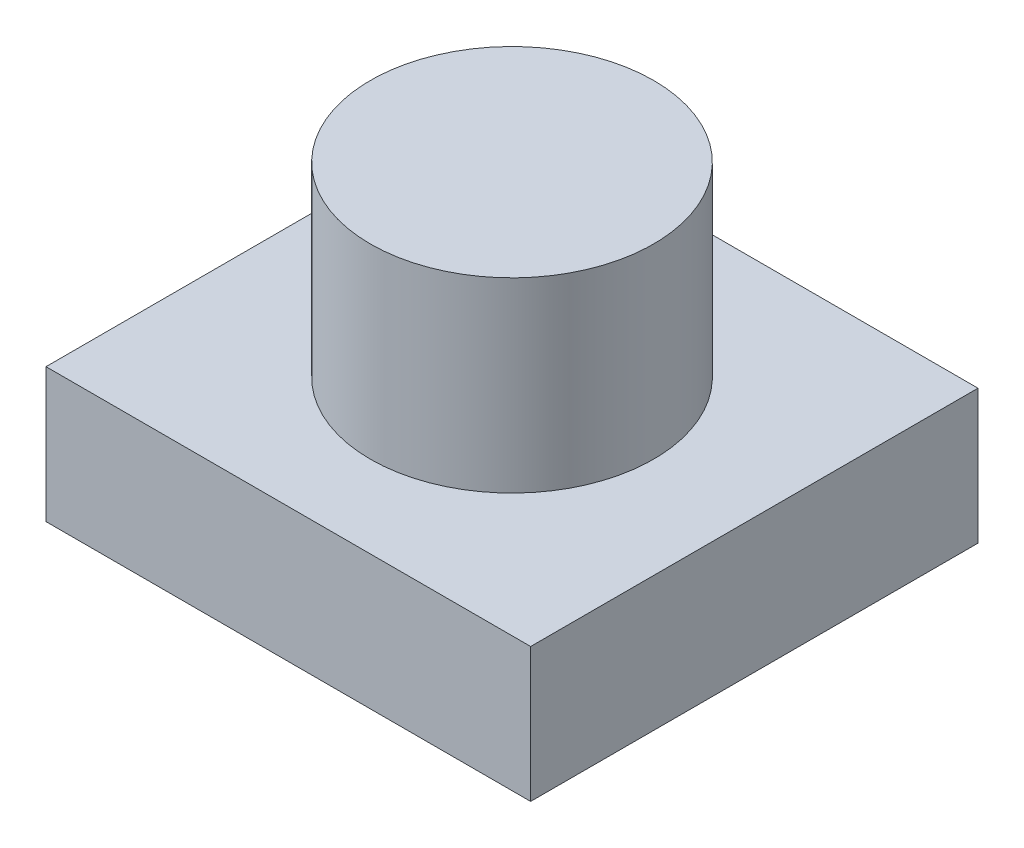
ISO-10303-21;
HEADER;
FILE_DESCRIPTION(('STEP AP214'),'2;1');
FILE_NAME('part.step','',(''),(''),'','','');
FILE_SCHEMA(('AUTOMOTIVE_DESIGN { 1 0 10303 214 1 1 1 1 }'));
ENDSEC;
DATA;
#1=APPLICATION_CONTEXT('core data for automotive mechanical design processes');
#2=APPLICATION_PROTOCOL_DEFINITION('international standard','automotive_design',2000,#1);
#3=PRODUCT_CONTEXT('',#1,'mechanical');
#4=PRODUCT('Part','Part','',(#3));
#5=PRODUCT_RELATED_PRODUCT_CATEGORY('part','',(#4));
#6=PRODUCT_DEFINITION_FORMATION('','',#4);
#7=PRODUCT_DEFINITION_CONTEXT('part definition',#1,'design');
#8=PRODUCT_DEFINITION('design','',#6,#7);
#9=PRODUCT_DEFINITION_SHAPE('','',#8);
#10=(LENGTH_UNIT() NAMED_UNIT(*) SI_UNIT(.MILLI.,.METRE.));
#11=(NAMED_UNIT(*) PLANE_ANGLE_UNIT() SI_UNIT($,.RADIAN.));
#12=(NAMED_UNIT(*) SI_UNIT($,.STERADIAN.) SOLID_ANGLE_UNIT());
#13=UNCERTAINTY_MEASURE_WITH_UNIT(LENGTH_MEASURE(1.E-05),#10,'distance_accuracy_value','');
#14=(GEOMETRIC_REPRESENTATION_CONTEXT(3) GLOBAL_UNCERTAINTY_ASSIGNED_CONTEXT((#13)) GLOBAL_UNIT_ASSIGNED_CONTEXT((#10,
#11,#12)) REPRESENTATION_CONTEXT('',''));
#15=CARTESIAN_POINT('',(0.,0.,0.));
#16=DIRECTION('',(0.,0.,1.));
#17=DIRECTION('',(1.,0.,0.));
#18=AXIS2_PLACEMENT_3D('',#15,#16,#17);
#19=CARTESIAN_POINT('',(0.,1.8,0.));
#20=DIRECTION('',(1.,0.,0.));
#21=DIRECTION('',(0.,0.,-1.));
#22=AXIS2_PLACEMENT_3D('',#19,#20,#21);
#23=PLANE('',#22);
#24=DIRECTION('',(0.,0.,1.));
#25=VECTOR('',#24,1.);
#26=CARTESIAN_POINT('',(0.,0.,0.));
#27=LINE('',#26,#25);
#28=CARTESIAN_POINT('',(0.,0.,-6.));
#29=VERTEX_POINT('',#28);
#30=CARTESIAN_POINT('',(0.,0.,0.));
#31=VERTEX_POINT('',#30);
#32=EDGE_CURVE('E104',#29,#31,#27,.T.);
#33=ORIENTED_EDGE('',*,*,#32,.T.);
#34=DIRECTION('',(0.,-1.,0.));
#35=VECTOR('',#34,1.);
#36=CARTESIAN_POINT('',(0.,1.8,0.));
#37=LINE('',#36,#35);
#38=CARTESIAN_POINT('',(0.,1.8,0.));
#39=VERTEX_POINT('',#38);
#40=EDGE_CURVE('E41',#39,#31,#37,.T.);
#41=ORIENTED_EDGE('',*,*,#40,.F.);
#42=DIRECTION('',(0.,0.,1.));
#43=VECTOR('',#42,1.);
#44=CARTESIAN_POINT('',(0.,1.8,0.));
#45=LINE('',#44,#43);
#46=CARTESIAN_POINT('',(0.,1.8,-6.));
#47=VERTEX_POINT('',#46);
#48=EDGE_CURVE('E91',#47,#39,#45,.T.);
#49=ORIENTED_EDGE('',*,*,#48,.F.);
#50=DIRECTION('',(0.,-1.,0.));
#51=VECTOR('',#50,1.);
#52=CARTESIAN_POINT('',(0.,1.8,-6.));
#53=LINE('',#52,#51);
#54=EDGE_CURVE('E100',#47,#29,#53,.T.);
#55=ORIENTED_EDGE('',*,*,#54,.T.);
#56=EDGE_LOOP('',(#33,#41,#49,#55));
#57=FACE_BOUND('',#56,.T.);
#58=ADVANCED_FACE('F38',(#57),#23,.F.);
#59=CARTESIAN_POINT('',(0.,1.8,0.));
#60=DIRECTION('',(0.,0.,-1.));
#61=DIRECTION('',(-1.,0.,0.));
#62=AXIS2_PLACEMENT_3D('',#59,#60,#61);
#63=PLANE('',#62);
#64=DIRECTION('',(1.,0.,0.));
#65=VECTOR('',#64,1.);
#66=CARTESIAN_POINT('',(0.,0.,0.));
#67=LINE('',#66,#65);
#68=CARTESIAN_POINT('',(6.5,0.,0.));
#69=VERTEX_POINT('',#68);
#70=EDGE_CURVE('E96',#31,#69,#67,.T.);
#71=ORIENTED_EDGE('',*,*,#70,.T.);
#72=DIRECTION('',(0.,-1.,0.));
#73=VECTOR('',#72,1.);
#74=CARTESIAN_POINT('',(6.5,1.8,0.));
#75=LINE('',#74,#73);
#76=CARTESIAN_POINT('',(6.5,1.8,0.));
#77=VERTEX_POINT('',#76);
#78=EDGE_CURVE('E94',#77,#69,#75,.T.);
#79=ORIENTED_EDGE('',*,*,#78,.F.);
#80=DIRECTION('',(1.,0.,0.));
#81=VECTOR('',#80,1.);
#82=CARTESIAN_POINT('',(0.,1.8,0.));
#83=LINE('',#82,#81);
#84=EDGE_CURVE('E86',#39,#77,#83,.T.);
#85=ORIENTED_EDGE('',*,*,#84,.F.);
#86=ORIENTED_EDGE('',*,*,#40,.T.);
#87=EDGE_LOOP('',(#71,#79,#85,#86));
#88=FACE_BOUND('',#87,.T.);
#89=ADVANCED_FACE('F95',(#88),#63,.F.);
#90=CARTESIAN_POINT('',(6.5,1.8,0.));
#91=DIRECTION('',(-1.,0.,0.));
#92=DIRECTION('',(0.,0.,1.));
#93=AXIS2_PLACEMENT_3D('',#90,#91,#92);
#94=PLANE('',#93);
#95=DIRECTION('',(0.,0.,-1.));
#96=VECTOR('',#95,1.);
#97=CARTESIAN_POINT('',(6.5,0.,0.));
#98=LINE('',#97,#96);
#99=CARTESIAN_POINT('',(6.5,0.,-6.));
#100=VERTEX_POINT('',#99);
#101=EDGE_CURVE('E72',#69,#100,#98,.T.);
#102=ORIENTED_EDGE('',*,*,#101,.T.);
#103=DIRECTION('',(0.,-1.,0.));
#104=VECTOR('',#103,1.);
#105=CARTESIAN_POINT('',(6.5,1.8,-6.));
#106=LINE('',#105,#104);
#107=CARTESIAN_POINT('',(6.5,1.8,-6.));
#108=VERTEX_POINT('',#107);
#109=EDGE_CURVE('E97',#108,#100,#106,.T.);
#110=ORIENTED_EDGE('',*,*,#109,.F.);
#111=DIRECTION('',(0.,0.,-1.));
#112=VECTOR('',#111,1.);
#113=CARTESIAN_POINT('',(6.5,1.8,0.));
#114=LINE('',#113,#112);
#115=EDGE_CURVE('E89',#77,#108,#114,.T.);
#116=ORIENTED_EDGE('',*,*,#115,.F.);
#117=ORIENTED_EDGE('',*,*,#78,.T.);
#118=EDGE_LOOP('',(#102,#110,#116,#117));
#119=FACE_BOUND('',#118,.T.);
#120=ADVANCED_FACE('F98',(#119),#94,.F.);
#121=CARTESIAN_POINT('',(0.,1.8,-6.));
#122=DIRECTION('',(0.,0.,1.));
#123=DIRECTION('',(1.,0.,0.));
#124=AXIS2_PLACEMENT_3D('',#121,#122,#123);
#125=PLANE('',#124);
#126=DIRECTION('',(-1.,0.,0.));
#127=VECTOR('',#126,1.);
#128=CARTESIAN_POINT('',(0.,0.,-6.));
#129=LINE('',#128,#127);
#130=EDGE_CURVE('E78',#100,#29,#129,.T.);
#131=ORIENTED_EDGE('',*,*,#130,.T.);
#132=ORIENTED_EDGE('',*,*,#54,.F.);
#133=DIRECTION('',(-1.,0.,0.));
#134=VECTOR('',#133,1.);
#135=CARTESIAN_POINT('',(0.,1.8,-6.));
#136=LINE('',#135,#134);
#137=EDGE_CURVE('E55',#108,#47,#136,.T.);
#138=ORIENTED_EDGE('',*,*,#137,.F.);
#139=ORIENTED_EDGE('',*,*,#109,.T.);
#140=EDGE_LOOP('',(#131,#132,#138,#139));
#141=FACE_BOUND('',#140,.T.);
#142=ADVANCED_FACE('F112',(#141),#125,.F.);
#143=CARTESIAN_POINT('',(0.,1.8,0.));
#144=DIRECTION('',(0.,-1.,0.));
#145=DIRECTION('',(0.,0.,-1.));
#146=AXIS2_PLACEMENT_3D('',#143,#144,#145);
#147=PLANE('',#146);
#148=CARTESIAN_POINT('',(3.25,1.8,-3.));
#149=DIRECTION('',(0.,1.,0.));
#150=DIRECTION('',(0.,0.,1.));
#151=AXIS2_PLACEMENT_3D('',#148,#149,#150);
#152=CIRCLE('',#151,1.9);
#153=CARTESIAN_POINT('',(3.25,1.8,-1.1));
#154=VERTEX_POINT('',#153);
#155=EDGE_CURVE('E11',#154,#154,#152,.T.);
#156=ORIENTED_EDGE('',*,*,#155,.F.);
#157=EDGE_LOOP('',(#156));
#158=FACE_BOUND('',#157,.T.);
#159=ORIENTED_EDGE('',*,*,#48,.T.);
#160=ORIENTED_EDGE('',*,*,#84,.T.);
#161=ORIENTED_EDGE('',*,*,#115,.T.);
#162=ORIENTED_EDGE('',*,*,#137,.T.);
#163=EDGE_LOOP('',(#159,#160,#161,#162));
#164=FACE_BOUND('',#163,.T.);
#165=ADVANCED_FACE('F87',(#158,#164),#147,.F.);
#166=CARTESIAN_POINT('',(0.,0.,0.));
#167=DIRECTION('',(0.,-1.,0.));
#168=DIRECTION('',(0.,0.,-1.));
#169=AXIS2_PLACEMENT_3D('',#166,#167,#168);
#170=PLANE('',#169);
#171=ORIENTED_EDGE('',*,*,#32,.F.);
#172=ORIENTED_EDGE('',*,*,#130,.F.);
#173=ORIENTED_EDGE('',*,*,#101,.F.);
#174=ORIENTED_EDGE('',*,*,#70,.F.);
#175=EDGE_LOOP('',(#171,#172,#173,#174));
#176=FACE_BOUND('',#175,.T.);
#177=ADVANCED_FACE('F115',(#176),#170,.T.);
#178=CARTESIAN_POINT('',(3.25,4.3,-3.));
#179=DIRECTION('',(0.,-1.,0.));
#180=DIRECTION('',(0.,0.,-1.));
#181=AXIS2_PLACEMENT_3D('',#178,#179,#180);
#182=CYLINDRICAL_SURFACE('',#181,1.9);
#183=CARTESIAN_POINT('',(3.25,4.3,-3.));
#184=DIRECTION('',(0.,1.,0.));
#185=DIRECTION('',(0.,0.,1.));
#186=AXIS2_PLACEMENT_3D('',#183,#184,#185);
#187=CIRCLE('',#186,1.9);
#188=CARTESIAN_POINT('',(3.25,4.3,-1.1));
#189=VERTEX_POINT('',#188);
#190=EDGE_CURVE('E107',#189,#189,#187,.T.);
#191=ORIENTED_EDGE('',*,*,#190,.F.);
#192=EDGE_LOOP('',(#191));
#193=FACE_BOUND('',#192,.T.);
#194=ORIENTED_EDGE('',*,*,#155,.T.);
#195=EDGE_LOOP('',(#194));
#196=FACE_BOUND('',#195,.T.);
#197=ADVANCED_FACE('F123',(#193,#196),#182,.T.);
#198=CARTESIAN_POINT('',(3.25,4.3,-3.));
#199=DIRECTION('',(0.,1.,0.));
#200=DIRECTION('',(0.,0.,1.));
#201=AXIS2_PLACEMENT_3D('',#198,#199,#200);
#202=PLANE('',#201);
#203=ORIENTED_EDGE('',*,*,#190,.T.);
#204=EDGE_LOOP('',(#203));
#205=FACE_BOUND('',#204,.T.);
#206=ADVANCED_FACE('F121',(#205),#202,.T.);
#207=CLOSED_SHELL('',(#58,#89,#120,#142,#165,#177,#197,#206));
#208=MANIFOLD_SOLID_BREP('B2',#207);
#209=ADVANCED_BREP_SHAPE_REPRESENTATION('',(#18,#208),#14);
#210=SHAPE_DEFINITION_REPRESENTATION(#9,#209);
ENDSEC;
END-ISO-10303-21;
